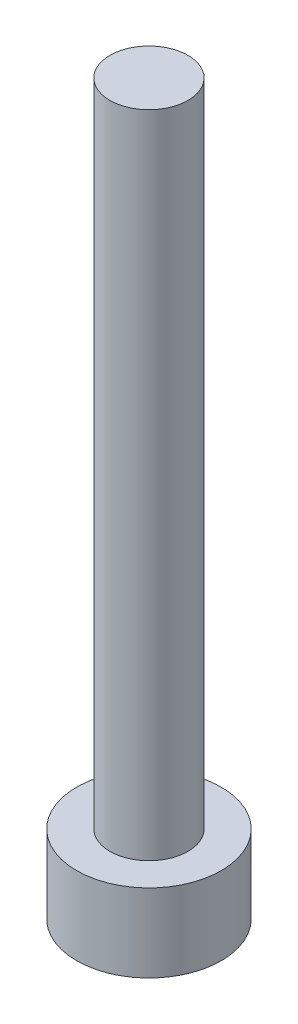
ISO-10303-21;
HEADER;
FILE_DESCRIPTION(('STEP AP214'),'2;1');
FILE_NAME('part.step','',(''),(''),'','','');
FILE_SCHEMA(('AUTOMOTIVE_DESIGN { 1 0 10303 214 1 1 1 1 }'));
ENDSEC;
DATA;
#1=APPLICATION_CONTEXT('core data for automotive mechanical design processes');
#2=APPLICATION_PROTOCOL_DEFINITION('international standard','automotive_design',2000,#1);
#3=PRODUCT_CONTEXT('',#1,'mechanical');
#4=PRODUCT('Part','Part','',(#3));
#5=PRODUCT_RELATED_PRODUCT_CATEGORY('part','',(#4));
#6=PRODUCT_DEFINITION_FORMATION('','',#4);
#7=PRODUCT_DEFINITION_CONTEXT('part definition',#1,'design');
#8=PRODUCT_DEFINITION('design','',#6,#7);
#9=PRODUCT_DEFINITION_SHAPE('','',#8);
#10=(LENGTH_UNIT() NAMED_UNIT(*) SI_UNIT(.MILLI.,.METRE.));
#11=(NAMED_UNIT(*) PLANE_ANGLE_UNIT() SI_UNIT($,.RADIAN.));
#12=(NAMED_UNIT(*) SI_UNIT($,.STERADIAN.) SOLID_ANGLE_UNIT());
#13=UNCERTAINTY_MEASURE_WITH_UNIT(LENGTH_MEASURE(1.E-05),#10,'distance_accuracy_value','');
#14=(GEOMETRIC_REPRESENTATION_CONTEXT(3) GLOBAL_UNCERTAINTY_ASSIGNED_CONTEXT((#13)) GLOBAL_UNIT_ASSIGNED_CONTEXT((#10,
#11,#12)) REPRESENTATION_CONTEXT('',''));
#15=CARTESIAN_POINT('',(0.,0.,0.));
#16=DIRECTION('',(0.,0.,1.));
#17=DIRECTION('',(1.,0.,0.));
#18=AXIS2_PLACEMENT_3D('',#15,#16,#17);
#19=CARTESIAN_POINT('',(0.,3.,0.));
#20=DIRECTION('',(0.,-1.,0.));
#21=DIRECTION('',(0.,0.,-1.));
#22=AXIS2_PLACEMENT_3D('',#19,#20,#21);
#23=CYLINDRICAL_SURFACE('',#22,2.78);
#24=CARTESIAN_POINT('',(0.,3.,0.));
#25=DIRECTION('',(0.,1.,0.));
#26=DIRECTION('',(0.,0.,1.));
#27=AXIS2_PLACEMENT_3D('',#24,#25,#26);
#28=CIRCLE('',#27,2.78);
#29=CARTESIAN_POINT('',(0.,3.,2.78));
#30=VERTEX_POINT('',#29);
#31=EDGE_CURVE('E10',#30,#30,#28,.T.);
#32=ORIENTED_EDGE('',*,*,#31,.F.);
#33=EDGE_LOOP('',(#32));
#34=FACE_BOUND('',#33,.T.);
#35=CARTESIAN_POINT('',(0.,0.,0.));
#36=DIRECTION('',(0.,1.,0.));
#37=DIRECTION('',(0.,0.,1.));
#38=AXIS2_PLACEMENT_3D('',#35,#36,#37);
#39=CIRCLE('',#38,2.78);
#40=CARTESIAN_POINT('',(0.,0.,2.78));
#41=VERTEX_POINT('',#40);
#42=EDGE_CURVE('E34',#41,#41,#39,.T.);
#43=ORIENTED_EDGE('',*,*,#42,.T.);
#44=EDGE_LOOP('',(#43));
#45=FACE_BOUND('',#44,.T.);
#46=ADVANCED_FACE('F31',(#34,#45),#23,.T.);
#47=CARTESIAN_POINT('',(0.,3.,0.));
#48=DIRECTION('',(0.,1.,0.));
#49=DIRECTION('',(0.,0.,1.));
#50=AXIS2_PLACEMENT_3D('',#47,#48,#49);
#51=PLANE('',#50);
#52=CARTESIAN_POINT('',(0.,3.,0.));
#53=DIRECTION('',(0.,1.,0.));
#54=DIRECTION('',(0.,0.,1.));
#55=AXIS2_PLACEMENT_3D('',#52,#53,#54);
#56=CIRCLE('',#55,1.5);
#57=CARTESIAN_POINT('',(0.,3.,1.5));
#58=VERTEX_POINT('',#57);
#59=EDGE_CURVE('E43',#58,#58,#56,.T.);
#60=ORIENTED_EDGE('',*,*,#59,.F.);
#61=EDGE_LOOP('',(#60));
#62=FACE_BOUND('',#61,.T.);
#63=ORIENTED_EDGE('',*,*,#31,.T.);
#64=EDGE_LOOP('',(#63));
#65=FACE_BOUND('',#64,.T.);
#66=ADVANCED_FACE('F58',(#62,#65),#51,.T.);
#67=CARTESIAN_POINT('',(0.,0.,0.));
#68=DIRECTION('',(0.,1.,0.));
#69=DIRECTION('',(0.,0.,1.));
#70=AXIS2_PLACEMENT_3D('',#67,#68,#69);
#71=PLANE('',#70);
#72=ORIENTED_EDGE('',*,*,#42,.F.);
#73=EDGE_LOOP('',(#72));
#74=FACE_BOUND('',#73,.T.);
#75=ADVANCED_FACE('F54',(#74),#71,.F.);
#76=CARTESIAN_POINT('',(0.,28.,0.));
#77=DIRECTION('',(0.,-1.,0.));
#78=DIRECTION('',(0.,0.,-1.));
#79=AXIS2_PLACEMENT_3D('',#76,#77,#78);
#80=CYLINDRICAL_SURFACE('',#79,1.5);
#81=CARTESIAN_POINT('',(0.,28.,0.));
#82=DIRECTION('',(0.,1.,0.));
#83=DIRECTION('',(0.,0.,1.));
#84=AXIS2_PLACEMENT_3D('',#81,#82,#83);
#85=CIRCLE('',#84,1.5);
#86=CARTESIAN_POINT('',(0.,28.,1.5));
#87=VERTEX_POINT('',#86);
#88=EDGE_CURVE('E41',#87,#87,#85,.T.);
#89=ORIENTED_EDGE('',*,*,#88,.F.);
#90=EDGE_LOOP('',(#89));
#91=FACE_BOUND('',#90,.T.);
#92=ORIENTED_EDGE('',*,*,#59,.T.);
#93=EDGE_LOOP('',(#92));
#94=FACE_BOUND('',#93,.T.);
#95=ADVANCED_FACE('F51',(#91,#94),#80,.T.);
#96=CARTESIAN_POINT('',(0.,28.,0.));
#97=DIRECTION('',(0.,1.,0.));
#98=DIRECTION('',(0.,0.,1.));
#99=AXIS2_PLACEMENT_3D('',#96,#97,#98);
#100=PLANE('',#99);
#101=ORIENTED_EDGE('',*,*,#88,.T.);
#102=EDGE_LOOP('',(#101));
#103=FACE_BOUND('',#102,.T.);
#104=ADVANCED_FACE('F49',(#103),#100,.T.);
#105=CLOSED_SHELL('',(#46,#66,#75,#95,#104));
#106=MANIFOLD_SOLID_BREP('B2',#105);
#107=ADVANCED_BREP_SHAPE_REPRESENTATION('',(#18,#106),#14);
#108=SHAPE_DEFINITION_REPRESENTATION(#9,#107);
ENDSEC;
END-ISO-10303-21;
